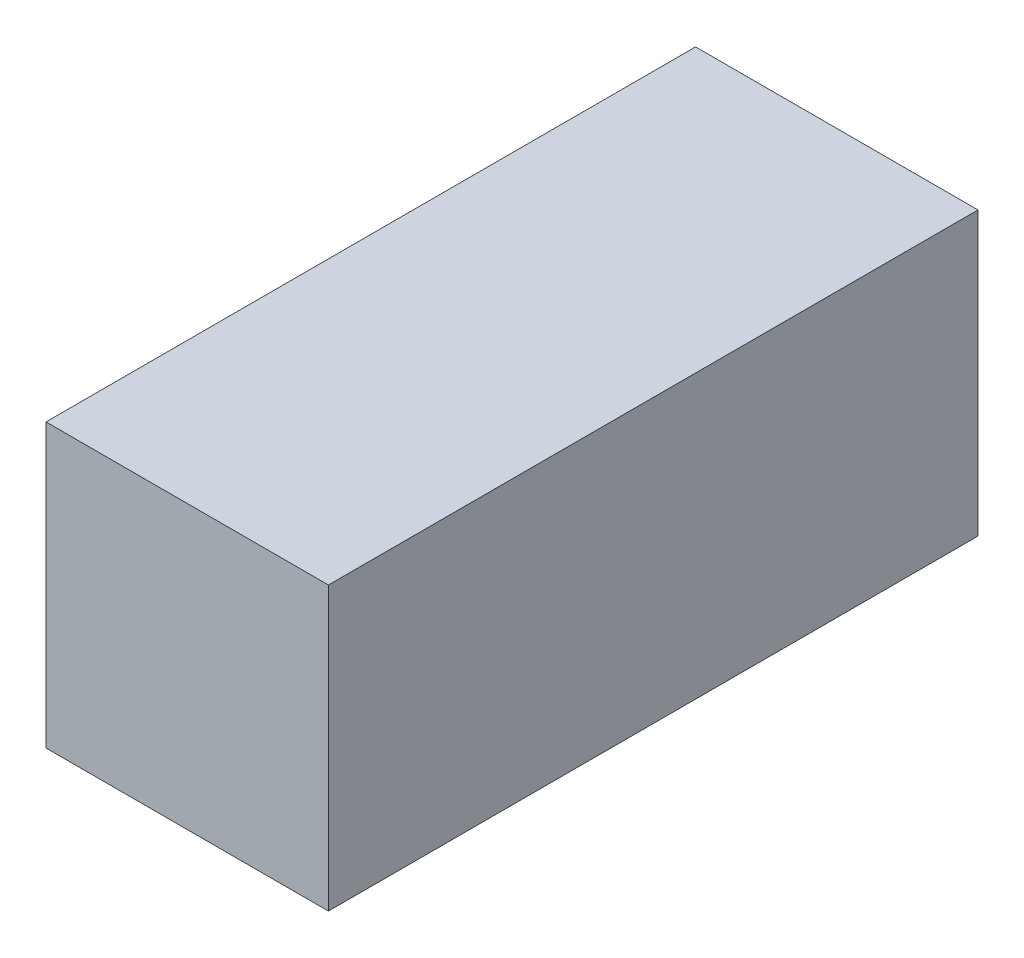
ISO-10303-21;
HEADER;
FILE_DESCRIPTION(('STEP AP214'),'2;1');
FILE_NAME('part.step','',(''),(''),'','','');
FILE_SCHEMA(('AUTOMOTIVE_DESIGN { 1 0 10303 214 1 1 1 1 }'));
ENDSEC;
DATA;
#1=APPLICATION_CONTEXT('core data for automotive mechanical design processes');
#2=APPLICATION_PROTOCOL_DEFINITION('international standard','automotive_design',2000,#1);
#3=PRODUCT_CONTEXT('',#1,'mechanical');
#4=PRODUCT('Part','Part','',(#3));
#5=PRODUCT_RELATED_PRODUCT_CATEGORY('part','',(#4));
#6=PRODUCT_DEFINITION_FORMATION('','',#4);
#7=PRODUCT_DEFINITION_CONTEXT('part definition',#1,'design');
#8=PRODUCT_DEFINITION('design','',#6,#7);
#9=PRODUCT_DEFINITION_SHAPE('','',#8);
#10=(LENGTH_UNIT() NAMED_UNIT(*) SI_UNIT(.MILLI.,.METRE.));
#11=(NAMED_UNIT(*) PLANE_ANGLE_UNIT() SI_UNIT($,.RADIAN.));
#12=(NAMED_UNIT(*) SI_UNIT($,.STERADIAN.) SOLID_ANGLE_UNIT());
#13=UNCERTAINTY_MEASURE_WITH_UNIT(LENGTH_MEASURE(1.E-05),#10,'distance_accuracy_value','');
#14=(GEOMETRIC_REPRESENTATION_CONTEXT(3) GLOBAL_UNCERTAINTY_ASSIGNED_CONTEXT((#13)) GLOBAL_UNIT_ASSIGNED_CONTEXT((#10,
#11,#12)) REPRESENTATION_CONTEXT('',''));
#15=CARTESIAN_POINT('',(0.,0.,0.));
#16=DIRECTION('',(0.,0.,1.));
#17=DIRECTION('',(1.,0.,0.));
#18=AXIS2_PLACEMENT_3D('',#15,#16,#17);
#19=CARTESIAN_POINT('',(-50.,-47.5,230.));
#20=DIRECTION('',(0.,1.,0.));
#21=DIRECTION('',(0.,0.,1.));
#22=AXIS2_PLACEMENT_3D('',#19,#20,#21);
#23=PLANE('',#22);
#24=DIRECTION('',(0.,0.,1.));
#25=VECTOR('',#24,1.);
#26=CARTESIAN_POINT('',(22.5,-47.5,87.5));
#27=LINE('',#26,#25);
#28=CARTESIAN_POINT('',(22.5,-47.5,27.5));
#29=VERTEX_POINT('',#28);
#30=CARTESIAN_POINT('',(22.5,-47.5,87.5));
#31=VERTEX_POINT('',#30);
#32=EDGE_CURVE('E117',#29,#31,#27,.T.);
#33=ORIENTED_EDGE('',*,*,#32,.F.);
#34=DIRECTION('',(-1.,0.,0.));
#35=VECTOR('',#34,1.);
#36=CARTESIAN_POINT('',(47.5,-47.5,27.5));
#37=LINE('',#36,#35);
#38=CARTESIAN_POINT('',(47.5,-47.5,27.5));
#39=VERTEX_POINT('',#38);
#40=EDGE_CURVE('E93',#39,#29,#37,.T.);
#41=ORIENTED_EDGE('',*,*,#40,.F.);
#42=DIRECTION('',(0.,0.,-1.));
#43=VECTOR('',#42,1.);
#44=CARTESIAN_POINT('',(47.5,-47.5,230.));
#45=LINE('',#44,#43);
#46=CARTESIAN_POINT('',(47.5,-47.5,87.5));
#47=VERTEX_POINT('',#46);
#48=EDGE_CURVE('E12',#47,#39,#45,.T.);
#49=ORIENTED_EDGE('',*,*,#48,.F.);
#50=DIRECTION('',(1.,0.,0.));
#51=VECTOR('',#50,1.);
#52=CARTESIAN_POINT('',(47.5,-47.5,87.5));
#53=LINE('',#52,#51);
#54=EDGE_CURVE('E52',#31,#47,#53,.T.);
#55=ORIENTED_EDGE('',*,*,#54,.F.);
#56=EDGE_LOOP('',(#33,#41,#49,#55));
#57=FACE_BOUND('',#56,.T.);
#58=ADVANCED_FACE('F49',(#57),#23,.F.);
#59=CARTESIAN_POINT('',(0.,47.5,0.));
#60=DIRECTION('',(0.,1.,0.));
#61=DIRECTION('',(0.,0.,1.));
#62=AXIS2_PLACEMENT_3D('',#59,#60,#61);
#63=PLANE('',#62);
#64=DIRECTION('',(0.,0.,1.));
#65=VECTOR('',#64,1.);
#66=CARTESIAN_POINT('',(47.5,47.5,87.5));
#67=LINE('',#66,#65);
#68=CARTESIAN_POINT('',(47.5,47.5,27.5));
#69=VERTEX_POINT('',#68);
#70=CARTESIAN_POINT('',(47.5,47.5,87.5));
#71=VERTEX_POINT('',#70);
#72=EDGE_CURVE('E100',#69,#71,#67,.T.);
#73=ORIENTED_EDGE('',*,*,#72,.F.);
#74=DIRECTION('',(1.,0.,0.));
#75=VECTOR('',#74,1.);
#76=CARTESIAN_POINT('',(47.5,47.5,27.5));
#77=LINE('',#76,#75);
#78=CARTESIAN_POINT('',(22.5,47.5,27.5));
#79=VERTEX_POINT('',#78);
#80=EDGE_CURVE('E108',#79,#69,#77,.T.);
#81=ORIENTED_EDGE('',*,*,#80,.F.);
#82=DIRECTION('',(0.,0.,-1.));
#83=VECTOR('',#82,1.);
#84=CARTESIAN_POINT('',(22.5,47.5,87.5));
#85=LINE('',#84,#83);
#86=CARTESIAN_POINT('',(22.5,47.5,87.5));
#87=VERTEX_POINT('',#86);
#88=EDGE_CURVE('E102',#87,#79,#85,.T.);
#89=ORIENTED_EDGE('',*,*,#88,.F.);
#90=DIRECTION('',(-1.,0.,0.));
#91=VECTOR('',#90,1.);
#92=CARTESIAN_POINT('',(47.5,47.5,87.5));
#93=LINE('',#92,#91);
#94=EDGE_CURVE('E89',#71,#87,#93,.T.);
#95=ORIENTED_EDGE('',*,*,#94,.F.);
#96=EDGE_LOOP('',(#73,#81,#89,#95));
#97=FACE_BOUND('',#96,.T.);
#98=ADVANCED_FACE('F98',(#97),#63,.T.);
#99=CARTESIAN_POINT('',(47.5,-50.002,87.5));
#100=DIRECTION('',(-1.,0.,0.));
#101=DIRECTION('',(0.,0.,1.));
#102=AXIS2_PLACEMENT_3D('',#99,#100,#101);
#103=PLANE('',#102);
#104=DIRECTION('',(0.,1.,0.));
#105=VECTOR('',#104,1.);
#106=CARTESIAN_POINT('',(47.5,-50.002,87.5));
#107=LINE('',#106,#105);
#108=EDGE_CURVE('E86',#47,#71,#107,.T.);
#109=ORIENTED_EDGE('',*,*,#108,.F.);
#110=ORIENTED_EDGE('',*,*,#48,.T.);
#111=DIRECTION('',(0.,1.,0.));
#112=VECTOR('',#111,1.);
#113=CARTESIAN_POINT('',(47.5,-50.002,27.5));
#114=LINE('',#113,#112);
#115=EDGE_CURVE('E103',#39,#69,#114,.T.);
#116=ORIENTED_EDGE('',*,*,#115,.T.);
#117=ORIENTED_EDGE('',*,*,#72,.T.);
#118=EDGE_LOOP('',(#109,#110,#116,#117));
#119=FACE_BOUND('',#118,.T.);
#120=ADVANCED_FACE('F105',(#119),#103,.F.);
#121=CARTESIAN_POINT('',(47.5,-50.002,27.5));
#122=DIRECTION('',(0.,0.,1.));
#123=DIRECTION('',(1.,0.,0.));
#124=AXIS2_PLACEMENT_3D('',#121,#122,#123);
#125=PLANE('',#124);
#126=ORIENTED_EDGE('',*,*,#115,.F.);
#127=ORIENTED_EDGE('',*,*,#40,.T.);
#128=DIRECTION('',(0.,1.,0.));
#129=VECTOR('',#128,1.);
#130=CARTESIAN_POINT('',(22.5,-50.002,27.5));
#131=LINE('',#130,#129);
#132=EDGE_CURVE('E114',#29,#79,#131,.T.);
#133=ORIENTED_EDGE('',*,*,#132,.T.);
#134=ORIENTED_EDGE('',*,*,#80,.T.);
#135=EDGE_LOOP('',(#126,#127,#133,#134));
#136=FACE_BOUND('',#135,.T.);
#137=ADVANCED_FACE('F123',(#136),#125,.F.);
#138=CARTESIAN_POINT('',(22.5,-50.002,87.5));
#139=DIRECTION('',(1.,0.,0.));
#140=DIRECTION('',(0.,0.,-1.));
#141=AXIS2_PLACEMENT_3D('',#138,#139,#140);
#142=PLANE('',#141);
#143=ORIENTED_EDGE('',*,*,#132,.F.);
#144=ORIENTED_EDGE('',*,*,#32,.T.);
#145=DIRECTION('',(0.,1.,0.));
#146=VECTOR('',#145,1.);
#147=CARTESIAN_POINT('',(22.5,-50.002,87.5));
#148=LINE('',#147,#146);
#149=EDGE_CURVE('E94',#31,#87,#148,.T.);
#150=ORIENTED_EDGE('',*,*,#149,.T.);
#151=ORIENTED_EDGE('',*,*,#88,.T.);
#152=EDGE_LOOP('',(#143,#144,#150,#151));
#153=FACE_BOUND('',#152,.T.);
#154=ADVANCED_FACE('F120',(#153),#142,.F.);
#155=CARTESIAN_POINT('',(47.5,-50.002,87.5));
#156=DIRECTION('',(0.,0.,-1.));
#157=DIRECTION('',(-1.,0.,0.));
#158=AXIS2_PLACEMENT_3D('',#155,#156,#157);
#159=PLANE('',#158);
#160=ORIENTED_EDGE('',*,*,#149,.F.);
#161=ORIENTED_EDGE('',*,*,#54,.T.);
#162=ORIENTED_EDGE('',*,*,#108,.T.);
#163=ORIENTED_EDGE('',*,*,#94,.T.);
#164=EDGE_LOOP('',(#160,#161,#162,#163));
#165=FACE_BOUND('',#164,.T.);
#166=ADVANCED_FACE('F88',(#165),#159,.F.);
#167=CLOSED_SHELL('',(#58,#98,#120,#137,#154,#166));
#168=MANIFOLD_SOLID_BREP('B2',#167);
#169=CARTESIAN_POINT('',(-50.,-47.5,230.));
#170=DIRECTION('',(0.,1.,0.));
#171=DIRECTION('',(0.,0.,1.));
#172=AXIS2_PLACEMENT_3D('',#169,#170,#171);
#173=PLANE('',#172);
#174=CARTESIAN_POINT('',(37.5,-47.5,102.5));
#175=DIRECTION('',(0.,1.,0.));
#176=DIRECTION('',(0.,0.,1.));
#177=AXIS2_PLACEMENT_3D('',#174,#175,#176);
#178=CIRCLE('',#177,10.);
#179=CARTESIAN_POINT('',(37.5,-47.5,112.5));
#180=VERTEX_POINT('',#179);
#181=EDGE_CURVE('E48',#180,#180,#178,.T.);
#182=ORIENTED_EDGE('',*,*,#181,.F.);
#183=EDGE_LOOP('',(#182));
#184=FACE_BOUND('',#183,.T.);
#185=ADVANCED_FACE('F180',(#184),#173,.F.);
#186=CARTESIAN_POINT('',(37.5,47.5,102.5));
#187=DIRECTION('',(0.,-1.,0.));
#188=DIRECTION('',(0.,0.,-1.));
#189=AXIS2_PLACEMENT_3D('',#186,#187,#188);
#190=PLANE('',#189);
#191=CARTESIAN_POINT('',(37.5,47.5,102.5));
#192=DIRECTION('',(0.,-1.,0.));
#193=DIRECTION('',(0.,0.,-1.));
#194=AXIS2_PLACEMENT_3D('',#191,#192,#193);
#195=CIRCLE('',#194,10.);
#196=CARTESIAN_POINT('',(37.5,47.5,92.5));
#197=VERTEX_POINT('',#196);
#198=EDGE_CURVE('E186',#197,#197,#195,.T.);
#199=ORIENTED_EDGE('',*,*,#198,.F.);
#200=EDGE_LOOP('',(#199));
#201=FACE_BOUND('',#200,.T.);
#202=ADVANCED_FACE('F194',(#201),#190,.F.);
#203=CARTESIAN_POINT('',(37.5,-50.002,102.5));
#204=DIRECTION('',(0.,1.,0.));
#205=DIRECTION('',(0.,0.,1.));
#206=AXIS2_PLACEMENT_3D('',#203,#204,#205);
#207=CYLINDRICAL_SURFACE('',#206,10.);
#208=ORIENTED_EDGE('',*,*,#198,.T.);
#209=EDGE_LOOP('',(#208));
#210=FACE_BOUND('',#209,.T.);
#211=ORIENTED_EDGE('',*,*,#181,.T.);
#212=EDGE_LOOP('',(#211));
#213=FACE_BOUND('',#212,.T.);
#214=ADVANCED_FACE('F192',(#210,#213),#207,.T.);
#215=CLOSED_SHELL('',(#185,#202,#214));
#216=MANIFOLD_SOLID_BREP('B6',#215);
#217=CARTESIAN_POINT('',(9.99999999999998,27.5,102.5));
#218=DIRECTION('',(0.,0.,-1.));
#219=DIRECTION('',(-1.,0.,0.));
#220=AXIS2_PLACEMENT_3D('',#217,#218,#219);
#221=CYLINDRICAL_SURFACE('',#220,10.);
#222=CARTESIAN_POINT('',(9.99999999999998,27.5,102.5));
#223=DIRECTION('',(0.,0.,1.));
#224=DIRECTION('',(1.,0.,0.));
#225=AXIS2_PLACEMENT_3D('',#222,#223,#224);
#226=CIRCLE('',#225,10.);
#227=CARTESIAN_POINT('',(20.,27.5,102.5));
#228=VERTEX_POINT('',#227);
#229=EDGE_CURVE('E179',#228,#228,#226,.T.);
#230=ORIENTED_EDGE('',*,*,#229,.F.);
#231=EDGE_LOOP('',(#230));
#232=FACE_BOUND('',#231,.T.);
#233=CARTESIAN_POINT('',(9.99999999999998,27.5,2.5));
#234=DIRECTION('',(0.,0.,1.));
#235=DIRECTION('',(1.,0.,0.));
#236=AXIS2_PLACEMENT_3D('',#233,#234,#235);
#237=CIRCLE('',#236,10.);
#238=CARTESIAN_POINT('',(20.,27.5,2.5));
#239=VERTEX_POINT('',#238);
#240=EDGE_CURVE('E231',#239,#239,#237,.T.);
#241=ORIENTED_EDGE('',*,*,#240,.T.);
#242=EDGE_LOOP('',(#241));
#243=FACE_BOUND('',#242,.T.);
#244=ADVANCED_FACE('F228',(#232,#243),#221,.T.);
#245=CARTESIAN_POINT('',(9.99999999999998,27.5,102.5));
#246=DIRECTION('',(0.,0.,1.));
#247=DIRECTION('',(1.,0.,0.));
#248=AXIS2_PLACEMENT_3D('',#245,#246,#247);
#249=PLANE('',#248);
#250=ORIENTED_EDGE('',*,*,#229,.T.);
#251=EDGE_LOOP('',(#250));
#252=FACE_BOUND('',#251,.T.);
#253=ADVANCED_FACE('F243',(#252),#249,.T.);
#254=CARTESIAN_POINT('',(9.99999999999998,27.5,2.5));
#255=DIRECTION('',(0.,0.,1.));
#256=DIRECTION('',(1.,0.,0.));
#257=AXIS2_PLACEMENT_3D('',#254,#255,#256);
#258=PLANE('',#257);
#259=ORIENTED_EDGE('',*,*,#240,.F.);
#260=EDGE_LOOP('',(#259));
#261=FACE_BOUND('',#260,.T.);
#262=ADVANCED_FACE('F241',(#261),#258,.F.);
#263=CLOSED_SHELL('',(#244,#253,#262));
#264=MANIFOLD_SOLID_BREP('B43',#263);
#265=CARTESIAN_POINT('',(-47.5,0.,0.));
#266=DIRECTION('',(1.,0.,0.));
#267=DIRECTION('',(0.,0.,-1.));
#268=AXIS2_PLACEMENT_3D('',#265,#266,#267);
#269=PLANE('',#268);
#270=CARTESIAN_POINT('',(-47.5,-27.5,12.5));
#271=DIRECTION('',(1.,0.,0.));
#272=DIRECTION('',(0.,0.,-1.));
#273=AXIS2_PLACEMENT_3D('',#270,#271,#272);
#274=CIRCLE('',#273,10.);
#275=CARTESIAN_POINT('',(-47.5,-27.5,2.5));
#276=VERTEX_POINT('',#275);
#277=EDGE_CURVE('E285',#276,#276,#274,.T.);
#278=ORIENTED_EDGE('',*,*,#277,.F.);
#279=EDGE_LOOP('',(#278));
#280=FACE_BOUND('',#279,.T.);
#281=ADVANCED_FACE('F278',(#280),#269,.F.);
#282=CARTESIAN_POINT('',(78.2842712474619,-27.5,12.5));
#283=DIRECTION('',(-1.,0.,0.));
#284=DIRECTION('',(0.,0.,1.));
#285=AXIS2_PLACEMENT_3D('',#282,#283,#284);
#286=CYLINDRICAL_SURFACE('',#285,10.);
#287=CARTESIAN_POINT('',(47.5,-27.5,12.5));
#288=DIRECTION('',(-1.,0.,0.));
#289=DIRECTION('',(0.,0.,1.));
#290=AXIS2_PLACEMENT_3D('',#287,#288,#289);
#291=CIRCLE('',#290,10.);
#292=CARTESIAN_POINT('',(47.5,-27.5,22.5));
#293=VERTEX_POINT('',#292);
#294=EDGE_CURVE('E227',#293,#293,#291,.T.);
#295=ORIENTED_EDGE('',*,*,#294,.T.);
#296=EDGE_LOOP('',(#295));
#297=FACE_BOUND('',#296,.T.);
#298=ORIENTED_EDGE('',*,*,#277,.T.);
#299=EDGE_LOOP('',(#298));
#300=FACE_BOUND('',#299,.T.);
#301=ADVANCED_FACE('F280',(#297,#300),#286,.T.);
#302=CARTESIAN_POINT('',(47.5,-50.,230.));
#303=DIRECTION('',(-1.,0.,0.));
#304=DIRECTION('',(0.,0.,1.));
#305=AXIS2_PLACEMENT_3D('',#302,#303,#304);
#306=PLANE('',#305);
#307=ORIENTED_EDGE('',*,*,#294,.F.);
#308=EDGE_LOOP('',(#307));
#309=FACE_BOUND('',#308,.T.);
#310=ADVANCED_FACE('F296',(#309),#306,.F.);
#311=CLOSED_SHELL('',(#281,#301,#310));
#312=MANIFOLD_SOLID_BREP('B174',#311);
#313=CARTESIAN_POINT('',(0.,-47.5,0.));
#314=DIRECTION('',(0.,1.,0.));
#315=DIRECTION('',(0.,0.,1.));
#316=AXIS2_PLACEMENT_3D('',#313,#314,#315);
#317=PLANE('',#316);
#318=DIRECTION('',(0.,0.,-1.));
#319=VECTOR('',#318,1.);
#320=CARTESIAN_POINT('',(-47.5,-47.5,0.));
#321=LINE('',#320,#319);
#322=CARTESIAN_POINT('',(-47.5,-47.5,122.5));
#323=VERTEX_POINT('',#322);
#324=CARTESIAN_POINT('',(-47.5,-47.5,22.5));
#325=VERTEX_POINT('',#324);
#326=EDGE_CURVE('E392',#323,#325,#321,.T.);
#327=ORIENTED_EDGE('',*,*,#326,.T.);
#328=DIRECTION('',(-1.,0.,0.));
#329=VECTOR('',#328,1.);
#330=CARTESIAN_POINT('',(0.,-47.5,22.5));
#331=LINE('',#330,#329);
#332=CARTESIAN_POINT('',(0.,-47.5,22.5));
#333=VERTEX_POINT('',#332);
#334=EDGE_CURVE('E276',#333,#325,#331,.T.);
#335=ORIENTED_EDGE('',*,*,#334,.F.);
#336=DIRECTION('',(0.,0.,-1.));
#337=VECTOR('',#336,1.);
#338=CARTESIAN_POINT('',(0.,-47.5,0.));
#339=LINE('',#338,#337);
#340=CARTESIAN_POINT('',(0.,-47.5,122.5));
#341=VERTEX_POINT('',#340);
#342=EDGE_CURVE('E378',#341,#333,#339,.T.);
#343=ORIENTED_EDGE('',*,*,#342,.F.);
#344=DIRECTION('',(-1.,0.,0.));
#345=VECTOR('',#344,1.);
#346=CARTESIAN_POINT('',(0.,-47.5,122.5));
#347=LINE('',#346,#345);
#348=EDGE_CURVE('E345',#341,#323,#347,.T.);
#349=ORIENTED_EDGE('',*,*,#348,.T.);
#350=EDGE_LOOP('',(#327,#335,#343,#349));
#351=FACE_BOUND('',#350,.T.);
#352=ADVANCED_FACE('F329',(#351),#317,.F.);
#353=CARTESIAN_POINT('',(0.,0.,22.5));
#354=DIRECTION('',(0.,0.,1.));
#355=DIRECTION('',(1.,0.,0.));
#356=AXIS2_PLACEMENT_3D('',#353,#354,#355);
#357=PLANE('',#356);
#358=DIRECTION('',(0.,1.,0.));
#359=VECTOR('',#358,1.);
#360=CARTESIAN_POINT('',(-47.5,0.,22.5));
#361=LINE('',#360,#359);
#362=CARTESIAN_POINT('',(-47.5,43.3365164152804,22.5));
#363=VERTEX_POINT('',#362);
#364=EDGE_CURVE('E383',#325,#363,#361,.T.);
#365=ORIENTED_EDGE('',*,*,#364,.T.);
#366=DIRECTION('',(-1.,0.,0.));
#367=VECTOR('',#366,1.);
#368=CARTESIAN_POINT('',(0.,43.3365164152804,22.5));
#369=LINE('',#368,#367);
#370=CARTESIAN_POINT('',(0.,43.3365164152804,22.5));
#371=VERTEX_POINT('',#370);
#372=EDGE_CURVE('E337',#371,#363,#369,.T.);
#373=ORIENTED_EDGE('',*,*,#372,.F.);
#374=DIRECTION('',(0.,1.,0.));
#375=VECTOR('',#374,1.);
#376=CARTESIAN_POINT('',(0.,0.,22.5));
#377=LINE('',#376,#375);
#378=EDGE_CURVE('E370',#333,#371,#377,.T.);
#379=ORIENTED_EDGE('',*,*,#378,.F.);
#380=ORIENTED_EDGE('',*,*,#334,.T.);
#381=EDGE_LOOP('',(#365,#373,#379,#380));
#382=FACE_BOUND('',#381,.T.);
#383=ADVANCED_FACE('F382',(#382),#357,.F.);
#384=CARTESIAN_POINT('',(0.,43.3365164152804,0.));
#385=DIRECTION('',(0.,1.,0.));
#386=DIRECTION('',(0.,0.,1.));
#387=AXIS2_PLACEMENT_3D('',#384,#385,#386);
#388=PLANE('',#387);
#389=DIRECTION('',(0.,0.,-1.));
#390=VECTOR('',#389,1.);
#391=CARTESIAN_POINT('',(-47.5,43.3365164152804,0.));
#392=LINE('',#391,#390);
#393=CARTESIAN_POINT('',(-47.5,43.3365164152804,122.5));
#394=VERTEX_POINT('',#393);
#395=EDGE_CURVE('E395',#394,#363,#392,.T.);
#396=ORIENTED_EDGE('',*,*,#395,.F.);
#397=DIRECTION('',(-1.,0.,0.));
#398=VECTOR('',#397,1.);
#399=CARTESIAN_POINT('',(0.,43.3365164152804,122.5));
#400=LINE('',#399,#398);
#401=CARTESIAN_POINT('',(0.,43.3365164152804,122.5));
#402=VERTEX_POINT('',#401);
#403=EDGE_CURVE('E359',#402,#394,#400,.T.);
#404=ORIENTED_EDGE('',*,*,#403,.F.);
#405=DIRECTION('',(0.,0.,-1.));
#406=VECTOR('',#405,1.);
#407=CARTESIAN_POINT('',(0.,43.3365164152804,0.));
#408=LINE('',#407,#406);
#409=EDGE_CURVE('E377',#402,#371,#408,.T.);
#410=ORIENTED_EDGE('',*,*,#409,.T.);
#411=ORIENTED_EDGE('',*,*,#372,.T.);
#412=EDGE_LOOP('',(#396,#404,#410,#411));
#413=FACE_BOUND('',#412,.T.);
#414=ADVANCED_FACE('F386',(#413),#388,.T.);
#415=CARTESIAN_POINT('',(0.,0.,122.5));
#416=DIRECTION('',(0.,0.,1.));
#417=DIRECTION('',(1.,0.,0.));
#418=AXIS2_PLACEMENT_3D('',#415,#416,#417);
#419=PLANE('',#418);
#420=DIRECTION('',(0.,1.,0.));
#421=VECTOR('',#420,1.);
#422=CARTESIAN_POINT('',(-47.5,0.,122.5));
#423=LINE('',#422,#421);
#424=EDGE_CURVE('E397',#323,#394,#423,.T.);
#425=ORIENTED_EDGE('',*,*,#424,.F.);
#426=ORIENTED_EDGE('',*,*,#348,.F.);
#427=DIRECTION('',(0.,1.,0.));
#428=VECTOR('',#427,1.);
#429=CARTESIAN_POINT('',(0.,0.,122.5));
#430=LINE('',#429,#428);
#431=EDGE_CURVE('E387',#341,#402,#430,.T.);
#432=ORIENTED_EDGE('',*,*,#431,.T.);
#433=ORIENTED_EDGE('',*,*,#403,.T.);
#434=EDGE_LOOP('',(#425,#426,#432,#433));
#435=FACE_BOUND('',#434,.T.);
#436=ADVANCED_FACE('F403',(#435),#419,.T.);
#437=CARTESIAN_POINT('',(0.,0.,0.));
#438=DIRECTION('',(1.,0.,0.));
#439=DIRECTION('',(0.,0.,-1.));
#440=AXIS2_PLACEMENT_3D('',#437,#438,#439);
#441=PLANE('',#440);
#442=ORIENTED_EDGE('',*,*,#342,.T.);
#443=ORIENTED_EDGE('',*,*,#378,.T.);
#444=ORIENTED_EDGE('',*,*,#409,.F.);
#445=ORIENTED_EDGE('',*,*,#431,.F.);
#446=EDGE_LOOP('',(#442,#443,#444,#445));
#447=FACE_BOUND('',#446,.T.);
#448=ADVANCED_FACE('F374',(#447),#441,.T.);
#449=CARTESIAN_POINT('',(-47.5,0.,0.));
#450=DIRECTION('',(1.,0.,0.));
#451=DIRECTION('',(0.,0.,-1.));
#452=AXIS2_PLACEMENT_3D('',#449,#450,#451);
#453=PLANE('',#452);
#454=ORIENTED_EDGE('',*,*,#326,.F.);
#455=ORIENTED_EDGE('',*,*,#424,.T.);
#456=ORIENTED_EDGE('',*,*,#395,.T.);
#457=ORIENTED_EDGE('',*,*,#364,.F.);
#458=EDGE_LOOP('',(#454,#455,#456,#457));
#459=FACE_BOUND('',#458,.T.);
#460=ADVANCED_FACE('F402',(#459),#453,.F.);
#461=CLOSED_SHELL('',(#352,#383,#414,#436,#448,#460));
#462=MANIFOLD_SOLID_BREP('B222',#461);
#463=CARTESIAN_POINT('',(50.,-50.,230.));
#464=DIRECTION('',(-1.,0.,0.));
#465=DIRECTION('',(0.,0.,1.));
#466=AXIS2_PLACEMENT_3D('',#463,#464,#465);
#467=PLANE('',#466);
#468=DIRECTION('',(0.,1.,0.));
#469=VECTOR('',#468,1.);
#470=CARTESIAN_POINT('',(50.,-50.,0.));
#471=LINE('',#470,#469);
#472=CARTESIAN_POINT('',(50.,-50.,0.));
#473=VERTEX_POINT('',#472);
#474=CARTESIAN_POINT('',(50.,50.,0.));
#475=VERTEX_POINT('',#474);
#476=EDGE_CURVE('E595',#473,#475,#471,.T.);
#477=ORIENTED_EDGE('',*,*,#476,.T.);
#478=DIRECTION('',(0.,0.,-1.));
#479=VECTOR('',#478,1.);
#480=CARTESIAN_POINT('',(50.,50.,230.));
#481=LINE('',#480,#479);
#482=CARTESIAN_POINT('',(50.,50.,230.));
#483=VERTEX_POINT('',#482);
#484=EDGE_CURVE('E618',#483,#475,#481,.T.);
#485=ORIENTED_EDGE('',*,*,#484,.F.);
#486=DIRECTION('',(0.,1.,0.));
#487=VECTOR('',#486,1.);
#488=CARTESIAN_POINT('',(50.,-50.,230.));
#489=LINE('',#488,#487);
#490=CARTESIAN_POINT('',(50.,-50.,230.));
#491=VERTEX_POINT('',#490);
#492=EDGE_CURVE('E603',#491,#483,#489,.T.);
#493=ORIENTED_EDGE('',*,*,#492,.F.);
#494=DIRECTION('',(0.,0.,-1.));
#495=VECTOR('',#494,1.);
#496=CARTESIAN_POINT('',(50.,-50.,230.));
#497=LINE('',#496,#495);
#498=EDGE_CURVE('E608',#491,#473,#497,.T.);
#499=ORIENTED_EDGE('',*,*,#498,.T.);
#500=EDGE_LOOP('',(#477,#485,#493,#499));
#501=FACE_BOUND('',#500,.T.);
#502=ADVANCED_FACE('F457',(#501),#467,.F.);
#503=CARTESIAN_POINT('',(-50.,50.,230.));
#504=DIRECTION('',(0.,-1.,0.));
#505=DIRECTION('',(0.,0.,-1.));
#506=AXIS2_PLACEMENT_3D('',#503,#504,#505);
#507=PLANE('',#506);
#508=DIRECTION('',(-1.,0.,0.));
#509=VECTOR('',#508,1.);
#510=CARTESIAN_POINT('',(-50.,50.,0.));
#511=LINE('',#510,#509);
#512=CARTESIAN_POINT('',(-50.,50.,0.));
#513=VERTEX_POINT('',#512);
#514=EDGE_CURVE('E598',#475,#513,#511,.T.);
#515=ORIENTED_EDGE('',*,*,#514,.T.);
#516=DIRECTION('',(0.,0.,-1.));
#517=VECTOR('',#516,1.);
#518=CARTESIAN_POINT('',(-50.,50.,230.));
#519=LINE('',#518,#517);
#520=CARTESIAN_POINT('',(-50.,50.,230.));
#521=VERTEX_POINT('',#520);
#522=EDGE_CURVE('E616',#521,#513,#519,.T.);
#523=ORIENTED_EDGE('',*,*,#522,.F.);
#524=DIRECTION('',(-1.,0.,0.));
#525=VECTOR('',#524,1.);
#526=CARTESIAN_POINT('',(-50.,50.,230.));
#527=LINE('',#526,#525);
#528=EDGE_CURVE('E548',#483,#521,#527,.T.);
#529=ORIENTED_EDGE('',*,*,#528,.F.);
#530=ORIENTED_EDGE('',*,*,#484,.T.);
#531=EDGE_LOOP('',(#515,#523,#529,#530));
#532=FACE_BOUND('',#531,.T.);
#533=ADVANCED_FACE('F679',(#532),#507,.F.);
#534=CARTESIAN_POINT('',(-50.,-50.,230.));
#535=DIRECTION('',(1.,0.,0.));
#536=DIRECTION('',(0.,0.,-1.));
#537=AXIS2_PLACEMENT_3D('',#534,#535,#536);
#538=PLANE('',#537);
#539=DIRECTION('',(0.,-1.,0.));
#540=VECTOR('',#539,1.);
#541=CARTESIAN_POINT('',(-50.,-50.,0.));
#542=LINE('',#541,#540);
#543=CARTESIAN_POINT('',(-50.,-50.,0.));
#544=VERTEX_POINT('',#543);
#545=EDGE_CURVE('E534',#513,#544,#542,.T.);
#546=ORIENTED_EDGE('',*,*,#545,.T.);
#547=DIRECTION('',(0.,0.,-1.));
#548=VECTOR('',#547,1.);
#549=CARTESIAN_POINT('',(-50.,-50.,230.));
#550=LINE('',#549,#548);
#551=CARTESIAN_POINT('',(-50.,-50.,230.));
#552=VERTEX_POINT('',#551);
#553=EDGE_CURVE('E614',#552,#544,#550,.T.);
#554=ORIENTED_EDGE('',*,*,#553,.F.);
#555=DIRECTION('',(0.,-1.,0.));
#556=VECTOR('',#555,1.);
#557=CARTESIAN_POINT('',(-50.,-50.,230.));
#558=LINE('',#557,#556);
#559=EDGE_CURVE('E606',#521,#552,#558,.T.);
#560=ORIENTED_EDGE('',*,*,#559,.F.);
#561=ORIENTED_EDGE('',*,*,#522,.T.);
#562=EDGE_LOOP('',(#546,#554,#560,#561));
#563=FACE_BOUND('',#562,.T.);
#564=ADVANCED_FACE('F683',(#563),#538,.F.);
#565=CARTESIAN_POINT('',(-50.,-50.,230.));
#566=DIRECTION('',(0.,1.,0.));
#567=DIRECTION('',(0.,0.,1.));
#568=AXIS2_PLACEMENT_3D('',#565,#566,#567);
#569=PLANE('',#568);
#570=DIRECTION('',(1.,0.,0.));
#571=VECTOR('',#570,1.);
#572=CARTESIAN_POINT('',(-50.,-50.,0.));
#573=LINE('',#572,#571);
#574=EDGE_CURVE('E540',#544,#473,#573,.T.);
#575=ORIENTED_EDGE('',*,*,#574,.T.);
#576=ORIENTED_EDGE('',*,*,#498,.F.);
#577=DIRECTION('',(1.,0.,0.));
#578=VECTOR('',#577,1.);
#579=CARTESIAN_POINT('',(-50.,-50.,230.));
#580=LINE('',#579,#578);
#581=EDGE_CURVE('E516',#552,#491,#580,.T.);
#582=ORIENTED_EDGE('',*,*,#581,.F.);
#583=ORIENTED_EDGE('',*,*,#553,.T.);
#584=EDGE_LOOP('',(#575,#576,#582,#583));
#585=FACE_BOUND('',#584,.T.);
#586=ADVANCED_FACE('F686',(#585),#569,.F.);
#587=CARTESIAN_POINT('',(0.,0.,230.));
#588=DIRECTION('',(0.,0.,-1.));
#589=DIRECTION('',(-1.,0.,0.));
#590=AXIS2_PLACEMENT_3D('',#587,#588,#589);
#591=PLANE('',#590);
#592=ORIENTED_EDGE('',*,*,#492,.T.);
#593=ORIENTED_EDGE('',*,*,#528,.T.);
#594=ORIENTED_EDGE('',*,*,#559,.T.);
#595=ORIENTED_EDGE('',*,*,#581,.T.);
#596=EDGE_LOOP('',(#592,#593,#594,#595));
#597=FACE_BOUND('',#596,.T.);
#598=ADVANCED_FACE('F689',(#597),#591,.F.);
#599=CARTESIAN_POINT('',(0.,0.,0.));
#600=DIRECTION('',(0.,0.,-1.));
#601=DIRECTION('',(-1.,0.,0.));
#602=AXIS2_PLACEMENT_3D('',#599,#600,#601);
#603=PLANE('',#602);
#604=ORIENTED_EDGE('',*,*,#476,.F.);
#605=ORIENTED_EDGE('',*,*,#574,.F.);
#606=ORIENTED_EDGE('',*,*,#545,.F.);
#607=ORIENTED_EDGE('',*,*,#514,.F.);
#608=EDGE_LOOP('',(#604,#605,#606,#607));
#609=FACE_BOUND('',#608,.T.);
#610=ADVANCED_FACE('F690',(#609),#603,.T.);
#611=CLOSED_SHELL('',(#502,#533,#564,#586,#598,#610));
#612=CARTESIAN_POINT('',(0.,0.,227.5));
#613=DIRECTION('',(0.,0.,-1.));
#614=DIRECTION('',(-1.,0.,0.));
#615=AXIS2_PLACEMENT_3D('',#612,#613,#614);
#616=PLANE('',#615);
#617=DIRECTION('',(0.,1.,0.));
#618=VECTOR('',#617,1.);
#619=CARTESIAN_POINT('',(47.5,0.,227.5));
#620=LINE('',#619,#618);
#621=CARTESIAN_POINT('',(47.5,-47.5,227.5));
#622=VERTEX_POINT('',#621);
#623=CARTESIAN_POINT('',(47.5,47.5,227.5));
#624=VERTEX_POINT('',#623);
#625=EDGE_CURVE('E623',#622,#624,#620,.T.);
#626=ORIENTED_EDGE('',*,*,#625,.F.);
#627=DIRECTION('',(1.,0.,0.));
#628=VECTOR('',#627,1.);
#629=CARTESIAN_POINT('',(0.,-47.5,227.5));
#630=LINE('',#629,#628);
#631=CARTESIAN_POINT('',(-47.5,-47.5,227.5));
#632=VERTEX_POINT('',#631);
#633=EDGE_CURVE('E327',#632,#622,#630,.T.);
#634=ORIENTED_EDGE('',*,*,#633,.F.);
#635=DIRECTION('',(0.,-1.,0.));
#636=VECTOR('',#635,1.);
#637=CARTESIAN_POINT('',(-47.5,0.,227.5));
#638=LINE('',#637,#636);
#639=CARTESIAN_POINT('',(-47.5,47.5,227.5));
#640=VERTEX_POINT('',#639);
#641=EDGE_CURVE('E467',#640,#632,#638,.T.);
#642=ORIENTED_EDGE('',*,*,#641,.F.);
#643=DIRECTION('',(-1.,0.,0.));
#644=VECTOR('',#643,1.);
#645=CARTESIAN_POINT('',(0.,47.5,227.5));
#646=LINE('',#645,#644);
#647=EDGE_CURVE('E621',#624,#640,#646,.T.);
#648=ORIENTED_EDGE('',*,*,#647,.F.);
#649=EDGE_LOOP('',(#626,#634,#642,#648));
#650=FACE_BOUND('',#649,.T.);
#651=DIRECTION('',(-1.,0.,0.));
#652=VECTOR('',#651,1.);
#653=CARTESIAN_POINT('',(-45.,-45.,227.5));
#654=LINE('',#653,#652);
#655=CARTESIAN_POINT('',(45.,-45.,227.5));
#656=VERTEX_POINT('',#655);
#657=CARTESIAN_POINT('',(-45.,-45.,227.5));
#658=VERTEX_POINT('',#657);
#659=EDGE_CURVE('E809',#656,#658,#654,.T.);
#660=ORIENTED_EDGE('',*,*,#659,.F.);
#661=DIRECTION('',(0.,-1.,0.));
#662=VECTOR('',#661,1.);
#663=CARTESIAN_POINT('',(45.,45.,227.5));
#664=LINE('',#663,#662);
#665=CARTESIAN_POINT('',(45.,45.,227.5));
#666=VERTEX_POINT('',#665);
#667=EDGE_CURVE('E593',#666,#656,#664,.T.);
#668=ORIENTED_EDGE('',*,*,#667,.F.);
#669=DIRECTION('',(1.,0.,0.));
#670=VECTOR('',#669,1.);
#671=CARTESIAN_POINT('',(-45.,45.,227.5));
#672=LINE('',#671,#670);
#673=CARTESIAN_POINT('',(-45.,45.,227.5));
#674=VERTEX_POINT('',#673);
#675=EDGE_CURVE('E589',#674,#666,#672,.T.);
#676=ORIENTED_EDGE('',*,*,#675,.F.);
#677=DIRECTION('',(0.,1.,0.));
#678=VECTOR('',#677,1.);
#679=CARTESIAN_POINT('',(-45.,45.,227.5));
#680=LINE('',#679,#678);
#681=EDGE_CURVE('E806',#658,#674,#680,.T.);
#682=ORIENTED_EDGE('',*,*,#681,.F.);
#683=EDGE_LOOP('',(#660,#668,#676,#682));
#684=FACE_BOUND('',#683,.T.);
#685=ADVANCED_FACE('F655',(#650,#684),#616,.T.);
#686=CARTESIAN_POINT('',(47.5,-50.,230.));
#687=DIRECTION('',(-1.,0.,0.));
#688=DIRECTION('',(0.,0.,1.));
#689=AXIS2_PLACEMENT_3D('',#686,#687,#688);
#690=PLANE('',#689);
#691=DIRECTION('',(0.,1.,0.));
#692=VECTOR('',#691,1.);
#693=CARTESIAN_POINT('',(47.5,0.,2.5));
#694=LINE('',#693,#692);
#695=CARTESIAN_POINT('',(47.5,-47.5,2.5));
#696=VERTEX_POINT('',#695);
#697=CARTESIAN_POINT('',(47.5,47.5,2.5));
#698=VERTEX_POINT('',#697);
#699=EDGE_CURVE('E461',#696,#698,#694,.T.);
#700=ORIENTED_EDGE('',*,*,#699,.F.);
#701=DIRECTION('',(0.,0.,-1.));
#702=VECTOR('',#701,1.);
#703=CARTESIAN_POINT('',(47.5,-47.5,230.));
#704=LINE('',#703,#702);
#705=EDGE_CURVE('E637',#622,#696,#704,.T.);
#706=ORIENTED_EDGE('',*,*,#705,.F.);
#707=ORIENTED_EDGE('',*,*,#625,.T.);
#708=DIRECTION('',(0.,0.,-1.));
#709=VECTOR('',#708,1.);
#710=CARTESIAN_POINT('',(47.5,47.5,230.));
#711=LINE('',#710,#709);
#712=EDGE_CURVE('E635',#624,#698,#711,.T.);
#713=ORIENTED_EDGE('',*,*,#712,.T.);
#714=EDGE_LOOP('',(#700,#706,#707,#713));
#715=FACE_BOUND('',#714,.T.);
#716=ADVANCED_FACE('F644',(#715),#690,.T.);
#717=CARTESIAN_POINT('',(-50.,47.5,230.));
#718=DIRECTION('',(0.,-1.,0.));
#719=DIRECTION('',(0.,0.,-1.));
#720=AXIS2_PLACEMENT_3D('',#717,#718,#719);
#721=PLANE('',#720);
#722=DIRECTION('',(-1.,0.,0.));
#723=VECTOR('',#722,1.);
#724=CARTESIAN_POINT('',(0.,47.5,2.5));
#725=LINE('',#724,#723);
#726=CARTESIAN_POINT('',(-47.5,47.5,2.5));
#727=VERTEX_POINT('',#726);
#728=EDGE_CURVE('E484',#698,#727,#725,.T.);
#729=ORIENTED_EDGE('',*,*,#728,.F.);
#730=ORIENTED_EDGE('',*,*,#712,.F.);
#731=ORIENTED_EDGE('',*,*,#647,.T.);
#732=DIRECTION('',(0.,0.,-1.));
#733=VECTOR('',#732,1.);
#734=CARTESIAN_POINT('',(-47.5,47.5,230.));
#735=LINE('',#734,#733);
#736=EDGE_CURVE('E631',#640,#727,#735,.T.);
#737=ORIENTED_EDGE('',*,*,#736,.T.);
#738=EDGE_LOOP('',(#729,#730,#731,#737));
#739=FACE_BOUND('',#738,.T.);
#740=ADVANCED_FACE('F646',(#739),#721,.T.);
#741=CARTESIAN_POINT('',(-47.5,-50.,230.));
#742=DIRECTION('',(1.,0.,0.));
#743=DIRECTION('',(0.,0.,-1.));
#744=AXIS2_PLACEMENT_3D('',#741,#742,#743);
#745=PLANE('',#744);
#746=DIRECTION('',(0.,-1.,0.));
#747=VECTOR('',#746,1.);
#748=CARTESIAN_POINT('',(-47.5,0.,2.5));
#749=LINE('',#748,#747);
#750=CARTESIAN_POINT('',(-47.5,-47.5,2.5));
#751=VERTEX_POINT('',#750);
#752=EDGE_CURVE('E633',#727,#751,#749,.T.);
#753=ORIENTED_EDGE('',*,*,#752,.F.);
#754=ORIENTED_EDGE('',*,*,#736,.F.);
#755=ORIENTED_EDGE('',*,*,#641,.T.);
#756=DIRECTION('',(0.,0.,-1.));
#757=VECTOR('',#756,1.);
#758=CARTESIAN_POINT('',(-47.5,-47.5,230.));
#759=LINE('',#758,#757);
#760=EDGE_CURVE('E626',#632,#751,#759,.T.);
#761=ORIENTED_EDGE('',*,*,#760,.T.);
#762=EDGE_LOOP('',(#753,#754,#755,#761));
#763=FACE_BOUND('',#762,.T.);
#764=ADVANCED_FACE('F652',(#763),#745,.T.);
#765=CARTESIAN_POINT('',(-50.,-47.5,230.));
#766=DIRECTION('',(0.,1.,0.));
#767=DIRECTION('',(0.,0.,1.));
#768=AXIS2_PLACEMENT_3D('',#765,#766,#767);
#769=PLANE('',#768);
#770=DIRECTION('',(1.,0.,0.));
#771=VECTOR('',#770,1.);
#772=CARTESIAN_POINT('',(0.,-47.5,2.5));
#773=LINE('',#772,#771);
#774=EDGE_CURVE('E629',#751,#696,#773,.T.);
#775=ORIENTED_EDGE('',*,*,#774,.F.);
#776=ORIENTED_EDGE('',*,*,#760,.F.);
#777=ORIENTED_EDGE('',*,*,#633,.T.);
#778=ORIENTED_EDGE('',*,*,#705,.T.);
#779=EDGE_LOOP('',(#775,#776,#777,#778));
#780=FACE_BOUND('',#779,.T.);
#781=ADVANCED_FACE('F657',(#780),#769,.T.);
#782=CARTESIAN_POINT('',(0.,0.,2.5));
#783=DIRECTION('',(0.,0.,-1.));
#784=DIRECTION('',(-1.,0.,0.));
#785=AXIS2_PLACEMENT_3D('',#782,#783,#784);
#786=PLANE('',#785);
#787=ORIENTED_EDGE('',*,*,#699,.T.);
#788=ORIENTED_EDGE('',*,*,#728,.T.);
#789=ORIENTED_EDGE('',*,*,#752,.T.);
#790=ORIENTED_EDGE('',*,*,#774,.T.);
#791=EDGE_LOOP('',(#787,#788,#789,#790));
#792=FACE_BOUND('',#791,.T.);
#793=ADVANCED_FACE('F459',(#792),#786,.F.);
#794=CARTESIAN_POINT('',(45.,45.,127.5));
#795=DIRECTION('',(-1.,0.,0.));
#796=DIRECTION('',(0.,0.,1.));
#797=AXIS2_PLACEMENT_3D('',#794,#795,#796);
#798=PLANE('',#797);
#799=ORIENTED_EDGE('',*,*,#667,.T.);
#800=DIRECTION('',(0.,0.,1.));
#801=VECTOR('',#800,1.);
#802=CARTESIAN_POINT('',(45.,-45.,127.5));
#803=LINE('',#802,#801);
#804=CARTESIAN_POINT('',(45.,-45.,127.5));
#805=VERTEX_POINT('',#804);
#806=EDGE_CURVE('E574',#805,#656,#803,.T.);
#807=ORIENTED_EDGE('',*,*,#806,.F.);
#808=DIRECTION('',(0.,-1.,0.));
#809=VECTOR('',#808,1.);
#810=CARTESIAN_POINT('',(45.,45.,127.5));
#811=LINE('',#810,#809);
#812=CARTESIAN_POINT('',(45.,45.,127.5));
#813=VERTEX_POINT('',#812);
#814=EDGE_CURVE('E581',#813,#805,#811,.T.);
#815=ORIENTED_EDGE('',*,*,#814,.F.);
#816=DIRECTION('',(0.,0.,1.));
#817=VECTOR('',#816,1.);
#818=CARTESIAN_POINT('',(45.,45.,127.5));
#819=LINE('',#818,#817);
#820=EDGE_CURVE('E804',#813,#666,#819,.T.);
#821=ORIENTED_EDGE('',*,*,#820,.T.);
#822=EDGE_LOOP('',(#799,#807,#815,#821));
#823=FACE_BOUND('',#822,.T.);
#824=ADVANCED_FACE('F591',(#823),#798,.F.);
#825=CARTESIAN_POINT('',(-45.,-45.,127.5));
#826=DIRECTION('',(0.,1.,0.));
#827=DIRECTION('',(0.,0.,1.));
#828=AXIS2_PLACEMENT_3D('',#825,#826,#827);
#829=PLANE('',#828);
#830=ORIENTED_EDGE('',*,*,#659,.T.);
#831=DIRECTION('',(0.,0.,1.));
#832=VECTOR('',#831,1.);
#833=CARTESIAN_POINT('',(-45.,-45.,127.5));
#834=LINE('',#833,#832);
#835=CARTESIAN_POINT('',(-45.,-45.,127.5));
#836=VERTEX_POINT('',#835);
#837=EDGE_CURVE('E577',#836,#658,#834,.T.);
#838=ORIENTED_EDGE('',*,*,#837,.F.);
#839=DIRECTION('',(-1.,0.,0.));
#840=VECTOR('',#839,1.);
#841=CARTESIAN_POINT('',(-45.,-45.,127.5));
#842=LINE('',#841,#840);
#843=EDGE_CURVE('E570',#805,#836,#842,.T.);
#844=ORIENTED_EDGE('',*,*,#843,.F.);
#845=ORIENTED_EDGE('',*,*,#806,.T.);
#846=EDGE_LOOP('',(#830,#838,#844,#845));
#847=FACE_BOUND('',#846,.T.);
#848=ADVANCED_FACE('F572',(#847),#829,.F.);
#849=CARTESIAN_POINT('',(-45.,45.,127.5));
#850=DIRECTION('',(1.,0.,0.));
#851=DIRECTION('',(0.,0.,-1.));
#852=AXIS2_PLACEMENT_3D('',#849,#850,#851);
#853=PLANE('',#852);
#854=ORIENTED_EDGE('',*,*,#681,.T.);
#855=DIRECTION('',(0.,0.,1.));
#856=VECTOR('',#855,1.);
#857=CARTESIAN_POINT('',(-45.,45.,127.5));
#858=LINE('',#857,#856);
#859=CARTESIAN_POINT('',(-45.,45.,127.5));
#860=VERTEX_POINT('',#859);
#861=EDGE_CURVE('E475',#860,#674,#858,.T.);
#862=ORIENTED_EDGE('',*,*,#861,.F.);
#863=DIRECTION('',(0.,1.,0.));
#864=VECTOR('',#863,1.);
#865=CARTESIAN_POINT('',(-45.,45.,127.5));
#866=LINE('',#865,#864);
#867=EDGE_CURVE('E580',#836,#860,#866,.T.);
#868=ORIENTED_EDGE('',*,*,#867,.F.);
#869=ORIENTED_EDGE('',*,*,#837,.T.);
#870=EDGE_LOOP('',(#854,#862,#868,#869));
#871=FACE_BOUND('',#870,.T.);
#872=ADVANCED_FACE('F699',(#871),#853,.F.);
#873=CARTESIAN_POINT('',(-45.,45.,127.5));
#874=DIRECTION('',(0.,-1.,0.));
#875=DIRECTION('',(0.,0.,-1.));
#876=AXIS2_PLACEMENT_3D('',#873,#874,#875);
#877=PLANE('',#876);
#878=ORIENTED_EDGE('',*,*,#675,.T.);
#879=ORIENTED_EDGE('',*,*,#820,.F.);
#880=DIRECTION('',(1.,0.,0.));
#881=VECTOR('',#880,1.);
#882=CARTESIAN_POINT('',(-45.,45.,127.5));
#883=LINE('',#882,#881);
#884=EDGE_CURVE('E585',#860,#813,#883,.T.);
#885=ORIENTED_EDGE('',*,*,#884,.F.);
#886=ORIENTED_EDGE('',*,*,#861,.T.);
#887=EDGE_LOOP('',(#878,#879,#885,#886));
#888=FACE_BOUND('',#887,.T.);
#889=ADVANCED_FACE('F702',(#888),#877,.F.);
#890=CARTESIAN_POINT('',(0.,0.,127.5));
#891=DIRECTION('',(0.,0.,1.));
#892=DIRECTION('',(1.,0.,0.));
#893=AXIS2_PLACEMENT_3D('',#890,#891,#892);
#894=PLANE('',#893);
#895=ORIENTED_EDGE('',*,*,#814,.T.);
#896=ORIENTED_EDGE('',*,*,#843,.T.);
#897=ORIENTED_EDGE('',*,*,#867,.T.);
#898=ORIENTED_EDGE('',*,*,#884,.T.);
#899=EDGE_LOOP('',(#895,#896,#897,#898));
#900=FACE_BOUND('',#899,.T.);
#901=ADVANCED_FACE('F584',(#900),#894,.F.);
#902=CLOSED_SHELL('',(#685,#716,#740,#764,#781,#793,#824,#848,#872,#889,#901));
#903=ORIENTED_CLOSED_SHELL('',*,#902,.T.);
#904=BREP_WITH_VOIDS('B270',#611,(#903));
#905=ADVANCED_BREP_SHAPE_REPRESENTATION('',(#18,#168,#216,#264,#312,#462,#904),#14);
#906=SHAPE_DEFINITION_REPRESENTATION(#9,#905);
ENDSEC;
END-ISO-10303-21;
